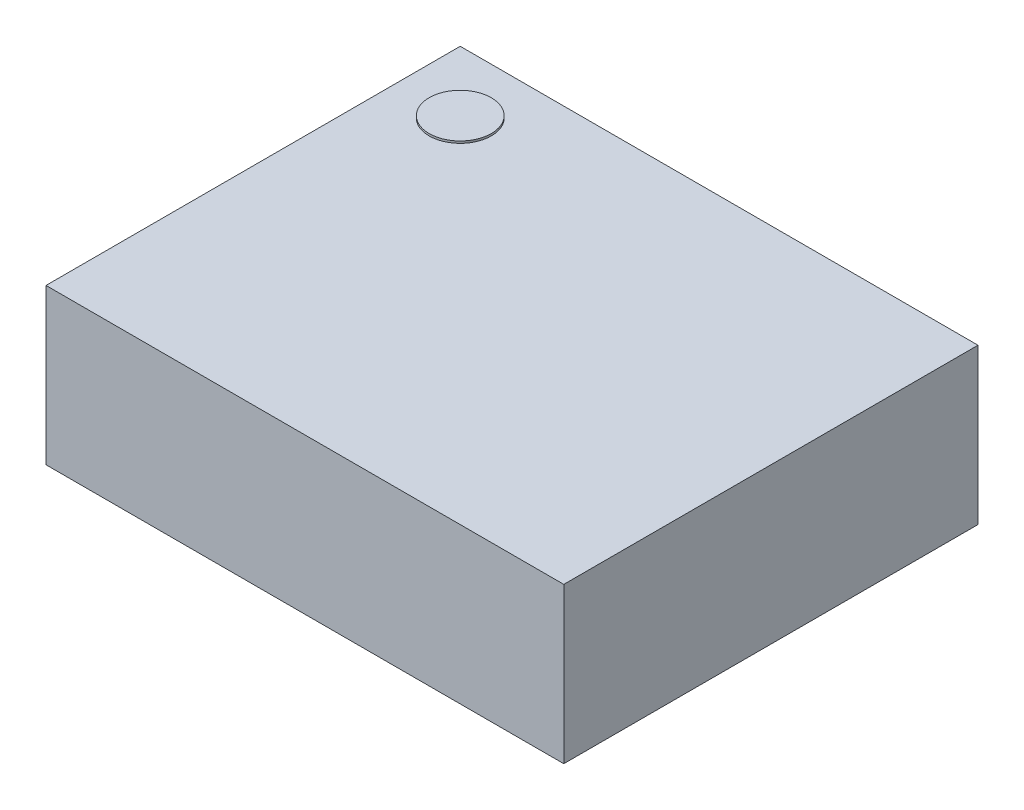
ISO-10303-21;
HEADER;
FILE_DESCRIPTION(('STEP AP214'),'2;1');
FILE_NAME('part.step','',(''),(''),'','','');
FILE_SCHEMA(('AUTOMOTIVE_DESIGN { 1 0 10303 214 1 1 1 1 }'));
ENDSEC;
DATA;
#1=APPLICATION_CONTEXT('core data for automotive mechanical design processes');
#2=APPLICATION_PROTOCOL_DEFINITION('international standard','automotive_design',2000,#1);
#3=PRODUCT_CONTEXT('',#1,'mechanical');
#4=PRODUCT('Part','Part','',(#3));
#5=PRODUCT_RELATED_PRODUCT_CATEGORY('part','',(#4));
#6=PRODUCT_DEFINITION_FORMATION('','',#4);
#7=PRODUCT_DEFINITION_CONTEXT('part definition',#1,'design');
#8=PRODUCT_DEFINITION('design','',#6,#7);
#9=PRODUCT_DEFINITION_SHAPE('','',#8);
#10=(LENGTH_UNIT() NAMED_UNIT(*) SI_UNIT(.MILLI.,.METRE.));
#11=(NAMED_UNIT(*) PLANE_ANGLE_UNIT() SI_UNIT($,.RADIAN.));
#12=(NAMED_UNIT(*) SI_UNIT($,.STERADIAN.) SOLID_ANGLE_UNIT());
#13=UNCERTAINTY_MEASURE_WITH_UNIT(LENGTH_MEASURE(1.E-05),#10,'distance_accuracy_value','');
#14=(GEOMETRIC_REPRESENTATION_CONTEXT(3) GLOBAL_UNCERTAINTY_ASSIGNED_CONTEXT((#13)) GLOBAL_UNIT_ASSIGNED_CONTEXT((#10,
#11,#12)) REPRESENTATION_CONTEXT('',''));
#15=CARTESIAN_POINT('',(0.,0.,0.));
#16=DIRECTION('',(0.,0.,1.));
#17=DIRECTION('',(1.,0.,0.));
#18=AXIS2_PLACEMENT_3D('',#15,#16,#17);
#19=CARTESIAN_POINT('',(-18.4516129032259,0.75,-10.6516129032258));
#20=DIRECTION('',(1.,0.,0.));
#21=DIRECTION('',(0.,0.,-1.));
#22=AXIS2_PLACEMENT_3D('',#19,#20,#21);
#23=PLANE('',#22);
#24=DIRECTION('',(0.,0.,1.));
#25=VECTOR('',#24,1.);
#26=CARTESIAN_POINT('',(-18.4516129032259,0.,-10.6516129032258));
#27=LINE('',#26,#25);
#28=CARTESIAN_POINT('',(-18.4516129032259,0.,-10.6516129032258));
#29=VERTEX_POINT('',#28);
#30=CARTESIAN_POINT('',(-18.4516129032259,0.,-8.65161290322583));
#31=VERTEX_POINT('',#30);
#32=EDGE_CURVE('E102',#29,#31,#27,.T.);
#33=ORIENTED_EDGE('',*,*,#32,.T.);
#34=DIRECTION('',(0.,-1.,0.));
#35=VECTOR('',#34,1.);
#36=CARTESIAN_POINT('',(-18.4516129032259,0.75,-8.65161290322583));
#37=LINE('',#36,#35);
#38=CARTESIAN_POINT('',(-18.4516129032259,0.75,-8.65161290322583));
#39=VERTEX_POINT('',#38);
#40=EDGE_CURVE('E11',#39,#31,#37,.T.);
#41=ORIENTED_EDGE('',*,*,#40,.F.);
#42=DIRECTION('',(0.,0.,1.));
#43=VECTOR('',#42,1.);
#44=CARTESIAN_POINT('',(-18.4516129032259,0.75,-10.6516129032258));
#45=LINE('',#44,#43);
#46=CARTESIAN_POINT('',(-18.4516129032259,0.75,-10.6516129032258));
#47=VERTEX_POINT('',#46);
#48=EDGE_CURVE('E90',#47,#39,#45,.T.);
#49=ORIENTED_EDGE('',*,*,#48,.F.);
#50=DIRECTION('',(0.,-1.,0.));
#51=VECTOR('',#50,1.);
#52=CARTESIAN_POINT('',(-18.4516129032259,0.75,-10.6516129032258));
#53=LINE('',#52,#51);
#54=EDGE_CURVE('E98',#47,#29,#53,.T.);
#55=ORIENTED_EDGE('',*,*,#54,.T.);
#56=EDGE_LOOP('',(#33,#41,#49,#55));
#57=FACE_BOUND('',#56,.T.);
#58=ADVANCED_FACE('F39',(#57),#23,.F.);
#59=CARTESIAN_POINT('',(-18.4516129032259,0.75,-8.65161290322583));
#60=DIRECTION('',(0.,0.,-1.));
#61=DIRECTION('',(-1.,0.,0.));
#62=AXIS2_PLACEMENT_3D('',#59,#60,#61);
#63=PLANE('',#62);
#64=DIRECTION('',(1.,0.,0.));
#65=VECTOR('',#64,1.);
#66=CARTESIAN_POINT('',(-18.4516129032259,0.,-8.65161290322583));
#67=LINE('',#66,#65);
#68=CARTESIAN_POINT('',(-15.9516129032259,0.,-8.65161290322583));
#69=VERTEX_POINT('',#68);
#70=EDGE_CURVE('E94',#31,#69,#67,.T.);
#71=ORIENTED_EDGE('',*,*,#70,.T.);
#72=DIRECTION('',(0.,-1.,0.));
#73=VECTOR('',#72,1.);
#74=CARTESIAN_POINT('',(-15.9516129032259,0.75,-8.65161290322583));
#75=LINE('',#74,#73);
#76=CARTESIAN_POINT('',(-15.9516129032259,0.75,-8.65161290322583));
#77=VERTEX_POINT('',#76);
#78=EDGE_CURVE('E47',#77,#69,#75,.T.);
#79=ORIENTED_EDGE('',*,*,#78,.F.);
#80=DIRECTION('',(1.,0.,0.));
#81=VECTOR('',#80,1.);
#82=CARTESIAN_POINT('',(-18.4516129032259,0.75,-8.65161290322583));
#83=LINE('',#82,#81);
#84=EDGE_CURVE('E85',#39,#77,#83,.T.);
#85=ORIENTED_EDGE('',*,*,#84,.F.);
#86=ORIENTED_EDGE('',*,*,#40,.T.);
#87=EDGE_LOOP('',(#71,#79,#85,#86));
#88=FACE_BOUND('',#87,.T.);
#89=ADVANCED_FACE('F93',(#88),#63,.F.);
#90=CARTESIAN_POINT('',(-15.9516129032259,0.75,-10.6516129032258));
#91=DIRECTION('',(-1.,0.,0.));
#92=DIRECTION('',(0.,0.,1.));
#93=AXIS2_PLACEMENT_3D('',#90,#91,#92);
#94=PLANE('',#93);
#95=DIRECTION('',(0.,0.,-1.));
#96=VECTOR('',#95,1.);
#97=CARTESIAN_POINT('',(-15.9516129032259,0.,-10.6516129032258));
#98=LINE('',#97,#96);
#99=CARTESIAN_POINT('',(-15.9516129032259,0.,-10.6516129032258));
#100=VERTEX_POINT('',#99);
#101=EDGE_CURVE('E72',#69,#100,#98,.T.);
#102=ORIENTED_EDGE('',*,*,#101,.T.);
#103=DIRECTION('',(0.,-1.,0.));
#104=VECTOR('',#103,1.);
#105=CARTESIAN_POINT('',(-15.9516129032259,0.75,-10.6516129032258));
#106=LINE('',#105,#104);
#107=CARTESIAN_POINT('',(-15.9516129032259,0.75,-10.6516129032258));
#108=VERTEX_POINT('',#107);
#109=EDGE_CURVE('E95',#108,#100,#106,.T.);
#110=ORIENTED_EDGE('',*,*,#109,.F.);
#111=DIRECTION('',(0.,0.,-1.));
#112=VECTOR('',#111,1.);
#113=CARTESIAN_POINT('',(-15.9516129032259,0.75,-10.6516129032258));
#114=LINE('',#113,#112);
#115=EDGE_CURVE('E88',#77,#108,#114,.T.);
#116=ORIENTED_EDGE('',*,*,#115,.F.);
#117=ORIENTED_EDGE('',*,*,#78,.T.);
#118=EDGE_LOOP('',(#102,#110,#116,#117));
#119=FACE_BOUND('',#118,.T.);
#120=ADVANCED_FACE('F96',(#119),#94,.F.);
#121=CARTESIAN_POINT('',(-18.4516129032259,0.75,-10.6516129032258));
#122=DIRECTION('',(0.,0.,1.));
#123=DIRECTION('',(1.,0.,0.));
#124=AXIS2_PLACEMENT_3D('',#121,#122,#123);
#125=PLANE('',#124);
#126=DIRECTION('',(-1.,0.,0.));
#127=VECTOR('',#126,1.);
#128=CARTESIAN_POINT('',(-18.4516129032259,0.,-10.6516129032258));
#129=LINE('',#128,#127);
#130=EDGE_CURVE('E78',#100,#29,#129,.T.);
#131=ORIENTED_EDGE('',*,*,#130,.T.);
#132=ORIENTED_EDGE('',*,*,#54,.F.);
#133=DIRECTION('',(-1.,0.,0.));
#134=VECTOR('',#133,1.);
#135=CARTESIAN_POINT('',(-18.4516129032259,0.75,-10.6516129032258));
#136=LINE('',#135,#134);
#137=EDGE_CURVE('E55',#108,#47,#136,.T.);
#138=ORIENTED_EDGE('',*,*,#137,.F.);
#139=ORIENTED_EDGE('',*,*,#109,.T.);
#140=EDGE_LOOP('',(#131,#132,#138,#139));
#141=FACE_BOUND('',#140,.T.);
#142=ADVANCED_FACE('F110',(#141),#125,.F.);
#143=CARTESIAN_POINT('',(0.,0.75,0.));
#144=DIRECTION('',(0.,1.,0.));
#145=DIRECTION('',(0.,0.,1.));
#146=AXIS2_PLACEMENT_3D('',#143,#144,#145);
#147=PLANE('',#146);
#148=CARTESIAN_POINT('',(-18.1516129032259,0.75,-10.3516129032258));
#149=DIRECTION('',(0.,1.,0.));
#150=DIRECTION('',(0.,0.,1.));
#151=AXIS2_PLACEMENT_3D('',#148,#149,#150);
#152=CIRCLE('',#151,0.150000000000002);
#153=CARTESIAN_POINT('',(-18.1516129032259,0.75,-10.2016129032258));
#154=VERTEX_POINT('',#153);
#155=EDGE_CURVE('E116',#154,#154,#152,.T.);
#156=ORIENTED_EDGE('',*,*,#155,.F.);
#157=EDGE_LOOP('',(#156));
#158=FACE_BOUND('',#157,.T.);
#159=ORIENTED_EDGE('',*,*,#48,.T.);
#160=ORIENTED_EDGE('',*,*,#84,.T.);
#161=ORIENTED_EDGE('',*,*,#115,.T.);
#162=ORIENTED_EDGE('',*,*,#137,.T.);
#163=EDGE_LOOP('',(#159,#160,#161,#162));
#164=FACE_BOUND('',#163,.T.);
#165=ADVANCED_FACE('F86',(#158,#164),#147,.T.);
#166=CARTESIAN_POINT('',(0.,0.,0.));
#167=DIRECTION('',(0.,1.,0.));
#168=DIRECTION('',(0.,0.,1.));
#169=AXIS2_PLACEMENT_3D('',#166,#167,#168);
#170=PLANE('',#169);
#171=ORIENTED_EDGE('',*,*,#32,.F.);
#172=ORIENTED_EDGE('',*,*,#130,.F.);
#173=ORIENTED_EDGE('',*,*,#101,.F.);
#174=ORIENTED_EDGE('',*,*,#70,.F.);
#175=EDGE_LOOP('',(#171,#172,#173,#174));
#176=FACE_BOUND('',#175,.T.);
#177=ADVANCED_FACE('F113',(#176),#170,.F.);
#178=CARTESIAN_POINT('',(-18.1516129032259,0.76,-10.3516129032258));
#179=DIRECTION('',(0.,-1.,0.));
#180=DIRECTION('',(0.,0.,-1.));
#181=AXIS2_PLACEMENT_3D('',#178,#179,#180);
#182=CYLINDRICAL_SURFACE('',#181,0.150000000000002);
#183=CARTESIAN_POINT('',(-18.1516129032259,0.76,-10.3516129032258));
#184=DIRECTION('',(0.,1.,0.));
#185=DIRECTION('',(0.,0.,1.));
#186=AXIS2_PLACEMENT_3D('',#183,#184,#185);
#187=CIRCLE('',#186,0.150000000000002);
#188=CARTESIAN_POINT('',(-18.1516129032259,0.76,-10.2016129032258));
#189=VERTEX_POINT('',#188);
#190=EDGE_CURVE('E105',#189,#189,#187,.T.);
#191=ORIENTED_EDGE('',*,*,#190,.F.);
#192=EDGE_LOOP('',(#191));
#193=FACE_BOUND('',#192,.T.);
#194=ORIENTED_EDGE('',*,*,#155,.T.);
#195=EDGE_LOOP('',(#194));
#196=FACE_BOUND('',#195,.T.);
#197=ADVANCED_FACE('F124',(#193,#196),#182,.T.);
#198=CARTESIAN_POINT('',(-18.1516129032259,0.76,-10.3516129032258));
#199=DIRECTION('',(0.,1.,0.));
#200=DIRECTION('',(0.,0.,1.));
#201=AXIS2_PLACEMENT_3D('',#198,#199,#200);
#202=PLANE('',#201);
#203=ORIENTED_EDGE('',*,*,#190,.T.);
#204=EDGE_LOOP('',(#203));
#205=FACE_BOUND('',#204,.T.);
#206=ADVANCED_FACE('F122',(#205),#202,.T.);
#207=CLOSED_SHELL('',(#58,#89,#120,#142,#165,#177,#197,#206));
#208=MANIFOLD_SOLID_BREP('B2',#207);
#209=ADVANCED_BREP_SHAPE_REPRESENTATION('',(#18,#208),#14);
#210=SHAPE_DEFINITION_REPRESENTATION(#9,#209);
ENDSEC;
END-ISO-10303-21;
